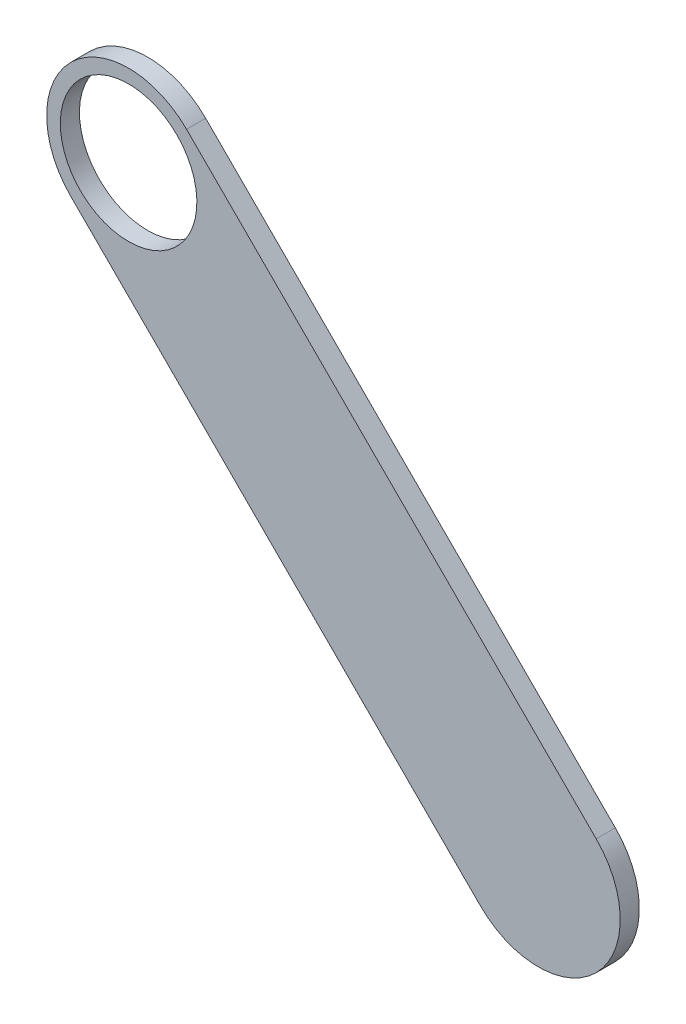
ISO-10303-21;
HEADER;
FILE_DESCRIPTION(('STEP AP214'),'2;1');
FILE_NAME('part.step','',(''),(''),'','','');
FILE_SCHEMA(('AUTOMOTIVE_DESIGN { 1 0 10303 214 1 1 1 1 }'));
ENDSEC;
DATA;
#1=APPLICATION_CONTEXT('core data for automotive mechanical design processes');
#2=APPLICATION_PROTOCOL_DEFINITION('international standard','automotive_design',2000,#1);
#3=PRODUCT_CONTEXT('',#1,'mechanical');
#4=PRODUCT('Part','Part','',(#3));
#5=PRODUCT_RELATED_PRODUCT_CATEGORY('part','',(#4));
#6=PRODUCT_DEFINITION_FORMATION('','',#4);
#7=PRODUCT_DEFINITION_CONTEXT('part definition',#1,'design');
#8=PRODUCT_DEFINITION('design','',#6,#7);
#9=PRODUCT_DEFINITION_SHAPE('','',#8);
#10=(LENGTH_UNIT() NAMED_UNIT(*) SI_UNIT(.MILLI.,.METRE.));
#11=(NAMED_UNIT(*) PLANE_ANGLE_UNIT() SI_UNIT($,.RADIAN.));
#12=(NAMED_UNIT(*) SI_UNIT($,.STERADIAN.) SOLID_ANGLE_UNIT());
#13=UNCERTAINTY_MEASURE_WITH_UNIT(LENGTH_MEASURE(1.E-05),#10,'distance_accuracy_value','');
#14=(GEOMETRIC_REPRESENTATION_CONTEXT(3) GLOBAL_UNCERTAINTY_ASSIGNED_CONTEXT((#13)) GLOBAL_UNIT_ASSIGNED_CONTEXT((#10,
#11,#12)) REPRESENTATION_CONTEXT('',''));
#15=CARTESIAN_POINT('',(0.,0.,0.));
#16=DIRECTION('',(0.,0.,1.));
#17=DIRECTION('',(1.,0.,0.));
#18=AXIS2_PLACEMENT_3D('',#15,#16,#17);
#19=CARTESIAN_POINT('',(131.418,-116.304,-0.045));
#20=DIRECTION('',(0.,0.,-1.));
#21=DIRECTION('',(0.,-1.,0.));
#22=AXIS2_PLACEMENT_3D('',#19,#20,#21);
#23=CYLINDRICAL_SURFACE('',#22,0.125);
#24=CARTESIAN_POINT('',(131.418,-116.304,1.6));
#25=DIRECTION('',(0.,0.,-1.));
#26=DIRECTION('',(0.,-1.,0.));
#27=AXIS2_PLACEMENT_3D('',#24,#25,#26);
#28=CIRCLE('',#27,0.125);
#29=CARTESIAN_POINT('',(131.418,-116.429,1.6));
#30=VERTEX_POINT('',#29);
#31=EDGE_CURVE('E112',#30,#30,#28,.T.);
#32=ORIENTED_EDGE('',*,*,#31,.T.);
#33=DIRECTION('',(0.,0.,1.));
#34=VECTOR('',#33,1.);
#35=CARTESIAN_POINT('',(131.418,-116.429,-0.045));
#36=LINE('',#35,#34);
#37=CARTESIAN_POINT('',(131.418,-116.429,1.635));
#38=VERTEX_POINT('',#37);
#39=EDGE_CURVE('E11',#30,#38,#36,.T.);
#40=ORIENTED_EDGE('',*,*,#39,.T.);
#41=CARTESIAN_POINT('',(131.418,-116.304,1.635));
#42=DIRECTION('',(0.,0.,-1.));
#43=DIRECTION('',(0.,-1.,0.));
#44=AXIS2_PLACEMENT_3D('',#41,#42,#43);
#45=CIRCLE('',#44,0.125);
#46=EDGE_CURVE('E20',#38,#38,#45,.T.);
#47=ORIENTED_EDGE('',*,*,#46,.F.);
#48=ORIENTED_EDGE('',*,*,#39,.F.);
#49=EDGE_LOOP('',(#32,#40,#47,#48));
#50=FACE_BOUND('',#49,.T.);
#51=ADVANCED_FACE('F17',(#50),#23,.F.);
#52=CARTESIAN_POINT('',(131.311933,-116.410066,1.6));
#53=DIRECTION('',(0.707106781186548,0.707106781186548,0.));
#54=DIRECTION('',(0.,0.,-1.));
#55=AXIS2_PLACEMENT_3D('',#52,#53,#54);
#56=PLANE('',#55);
#57=DIRECTION('',(0.707106781186548,-0.707106781186548,0.));
#58=VECTOR('',#57,1.);
#59=CARTESIAN_POINT('',(131.311933,-116.410066,1.6));
#60=LINE('',#59,#58);
#61=CARTESIAN_POINT('',(131.311933,-116.410066,1.6));
#62=VERTEX_POINT('',#61);
#63=CARTESIAN_POINT('',(132.061933,-117.160066,1.6));
#64=VERTEX_POINT('',#63);
#65=EDGE_CURVE('E121',#62,#64,#60,.T.);
#66=ORIENTED_EDGE('',*,*,#65,.T.);
#67=DIRECTION('',(0.,0.,1.));
#68=VECTOR('',#67,1.);
#69=CARTESIAN_POINT('',(132.061933,-117.160066,1.6));
#70=LINE('',#69,#68);
#71=CARTESIAN_POINT('',(132.061933,-117.160066,1.635));
#72=VERTEX_POINT('',#71);
#73=EDGE_CURVE('E84',#64,#72,#70,.T.);
#74=ORIENTED_EDGE('',*,*,#73,.T.);
#75=DIRECTION('',(0.707106781186548,-0.707106781186548,0.));
#76=VECTOR('',#75,1.);
#77=CARTESIAN_POINT('',(131.311933,-116.410066,1.635));
#78=LINE('',#77,#76);
#79=CARTESIAN_POINT('',(131.311933,-116.410066,1.635));
#80=VERTEX_POINT('',#79);
#81=EDGE_CURVE('E114',#80,#72,#78,.T.);
#82=ORIENTED_EDGE('',*,*,#81,.F.);
#83=DIRECTION('',(0.,0.,1.));
#84=VECTOR('',#83,1.);
#85=CARTESIAN_POINT('',(131.311933,-116.410066,1.6));
#86=LINE('',#85,#84);
#87=EDGE_CURVE('E130',#62,#80,#86,.T.);
#88=ORIENTED_EDGE('',*,*,#87,.F.);
#89=EDGE_LOOP('',(#66,#74,#82,#88));
#90=FACE_BOUND('',#89,.T.);
#91=ADVANCED_FACE('F140',(#90),#56,.F.);
#92=CARTESIAN_POINT('',(132.274066,-116.947933,1.635));
#93=DIRECTION('',(0.,0.,1.));
#94=DIRECTION('',(1.,0.,0.));
#95=AXIS2_PLACEMENT_3D('',#92,#93,#94);
#96=PLANE('',#95);
#97=ORIENTED_EDGE('',*,*,#46,.T.);
#98=EDGE_LOOP('',(#97));
#99=FACE_BOUND('',#98,.T.);
#100=DIRECTION('',(-0.707106781186548,0.707106781186548,0.));
#101=VECTOR('',#100,1.);
#102=CARTESIAN_POINT('',(132.274066,-116.947933,1.635));
#103=LINE('',#102,#101);
#104=CARTESIAN_POINT('',(132.274066,-116.947933,1.635));
#105=VERTEX_POINT('',#104);
#106=CARTESIAN_POINT('',(131.524066,-116.197933,1.635));
#107=VERTEX_POINT('',#106);
#108=EDGE_CURVE('E96',#105,#107,#103,.T.);
#109=ORIENTED_EDGE('',*,*,#108,.T.);
#110=CARTESIAN_POINT('',(131.4179995,-116.3039995,1.635));
#111=DIRECTION('',(0.,0.,1.));
#112=DIRECTION('',(0.707106781186548,0.707106781186548,0.));
#113=AXIS2_PLACEMENT_3D('',#110,#111,#112);
#114=CIRCLE('',#113,0.150000682813);
#115=EDGE_CURVE('E124',#107,#80,#114,.T.);
#116=ORIENTED_EDGE('',*,*,#115,.T.);
#117=ORIENTED_EDGE('',*,*,#81,.T.);
#118=CARTESIAN_POINT('',(132.1679995,-117.0539995,1.635));
#119=DIRECTION('',(0.,0.,1.));
#120=DIRECTION('',(-0.707106781186548,-0.707106781186548,0.));
#121=AXIS2_PLACEMENT_3D('',#118,#119,#120);
#122=CIRCLE('',#121,0.150000682813);
#123=EDGE_CURVE('E88',#72,#105,#122,.T.);
#124=ORIENTED_EDGE('',*,*,#123,.T.);
#125=EDGE_LOOP('',(#109,#116,#117,#124));
#126=FACE_BOUND('',#125,.T.);
#127=ADVANCED_FACE('F142',(#99,#126),#96,.T.);
#128=CARTESIAN_POINT('',(132.274066,-116.947933,1.6));
#129=DIRECTION('',(0.,0.,1.));
#130=DIRECTION('',(1.,0.,0.));
#131=AXIS2_PLACEMENT_3D('',#128,#129,#130);
#132=PLANE('',#131);
#133=ORIENTED_EDGE('',*,*,#31,.F.);
#134=EDGE_LOOP('',(#133));
#135=FACE_BOUND('',#134,.T.);
#136=CARTESIAN_POINT('',(132.1679995,-117.0539995,1.6));
#137=DIRECTION('',(0.,0.,1.));
#138=DIRECTION('',(-0.707106781186548,-0.707106781186548,0.));
#139=AXIS2_PLACEMENT_3D('',#136,#137,#138);
#140=CIRCLE('',#139,0.150000682813);
#141=CARTESIAN_POINT('',(132.274066,-116.947933,1.6));
#142=VERTEX_POINT('',#141);
#143=EDGE_CURVE('E77',#64,#142,#140,.T.);
#144=ORIENTED_EDGE('',*,*,#143,.F.);
#145=ORIENTED_EDGE('',*,*,#65,.F.);
#146=CARTESIAN_POINT('',(131.4179995,-116.3039995,1.6));
#147=DIRECTION('',(0.,0.,1.));
#148=DIRECTION('',(0.707106781186548,0.707106781186548,0.));
#149=AXIS2_PLACEMENT_3D('',#146,#147,#148);
#150=CIRCLE('',#149,0.150000682813);
#151=CARTESIAN_POINT('',(131.524066,-116.197933,1.6));
#152=VERTEX_POINT('',#151);
#153=EDGE_CURVE('E101',#152,#62,#150,.T.);
#154=ORIENTED_EDGE('',*,*,#153,.F.);
#155=DIRECTION('',(-0.707106781186548,0.707106781186548,0.));
#156=VECTOR('',#155,1.);
#157=CARTESIAN_POINT('',(132.274066,-116.947933,1.6));
#158=LINE('',#157,#156);
#159=EDGE_CURVE('E94',#142,#152,#158,.T.);
#160=ORIENTED_EDGE('',*,*,#159,.F.);
#161=EDGE_LOOP('',(#144,#145,#154,#160));
#162=FACE_BOUND('',#161,.T.);
#163=ADVANCED_FACE('F99',(#135,#162),#132,.F.);
#164=CARTESIAN_POINT('',(131.4179995,-116.3039995,1.6));
#165=DIRECTION('',(0.,0.,-1.));
#166=DIRECTION('',(0.707106781186548,0.707106781186548,0.));
#167=AXIS2_PLACEMENT_3D('',#164,#165,#166);
#168=CYLINDRICAL_SURFACE('',#167,0.150000682813);
#169=ORIENTED_EDGE('',*,*,#153,.T.);
#170=ORIENTED_EDGE('',*,*,#87,.T.);
#171=ORIENTED_EDGE('',*,*,#115,.F.);
#172=DIRECTION('',(0.,0.,1.));
#173=VECTOR('',#172,1.);
#174=CARTESIAN_POINT('',(131.524066,-116.197933,1.6));
#175=LINE('',#174,#173);
#176=EDGE_CURVE('E104',#152,#107,#175,.T.);
#177=ORIENTED_EDGE('',*,*,#176,.F.);
#178=EDGE_LOOP('',(#169,#170,#171,#177));
#179=FACE_BOUND('',#178,.T.);
#180=ADVANCED_FACE('F138',(#179),#168,.T.);
#181=CARTESIAN_POINT('',(132.1679995,-117.0539995,1.6));
#182=DIRECTION('',(0.,0.,-1.));
#183=DIRECTION('',(-0.707106781186548,-0.707106781186548,0.));
#184=AXIS2_PLACEMENT_3D('',#181,#182,#183);
#185=CYLINDRICAL_SURFACE('',#184,0.150000682813);
#186=ORIENTED_EDGE('',*,*,#143,.T.);
#187=DIRECTION('',(0.,0.,1.));
#188=VECTOR('',#187,1.);
#189=CARTESIAN_POINT('',(132.274066,-116.947933,1.6));
#190=LINE('',#189,#188);
#191=EDGE_CURVE('E81',#142,#105,#190,.T.);
#192=ORIENTED_EDGE('',*,*,#191,.T.);
#193=ORIENTED_EDGE('',*,*,#123,.F.);
#194=ORIENTED_EDGE('',*,*,#73,.F.);
#195=EDGE_LOOP('',(#186,#192,#193,#194));
#196=FACE_BOUND('',#195,.T.);
#197=ADVANCED_FACE('F79',(#196),#185,.T.);
#198=CARTESIAN_POINT('',(132.274066,-116.947933,1.6));
#199=DIRECTION('',(-0.707106781186548,-0.707106781186548,0.));
#200=DIRECTION('',(-0.707106781186548,0.707106781186548,0.));
#201=AXIS2_PLACEMENT_3D('',#198,#199,#200);
#202=PLANE('',#201);
#203=ORIENTED_EDGE('',*,*,#159,.T.);
#204=ORIENTED_EDGE('',*,*,#176,.T.);
#205=ORIENTED_EDGE('',*,*,#108,.F.);
#206=ORIENTED_EDGE('',*,*,#191,.F.);
#207=EDGE_LOOP('',(#203,#204,#205,#206));
#208=FACE_BOUND('',#207,.T.);
#209=ADVANCED_FACE('F92',(#208),#202,.F.);
#210=CLOSED_SHELL('',(#51,#91,#127,#163,#180,#197,#209));
#211=MANIFOLD_SOLID_BREP('B1',#210);
#212=ADVANCED_BREP_SHAPE_REPRESENTATION('',(#18,#211),#14);
#213=SHAPE_DEFINITION_REPRESENTATION(#9,#212);
ENDSEC;
END-ISO-10303-21;
